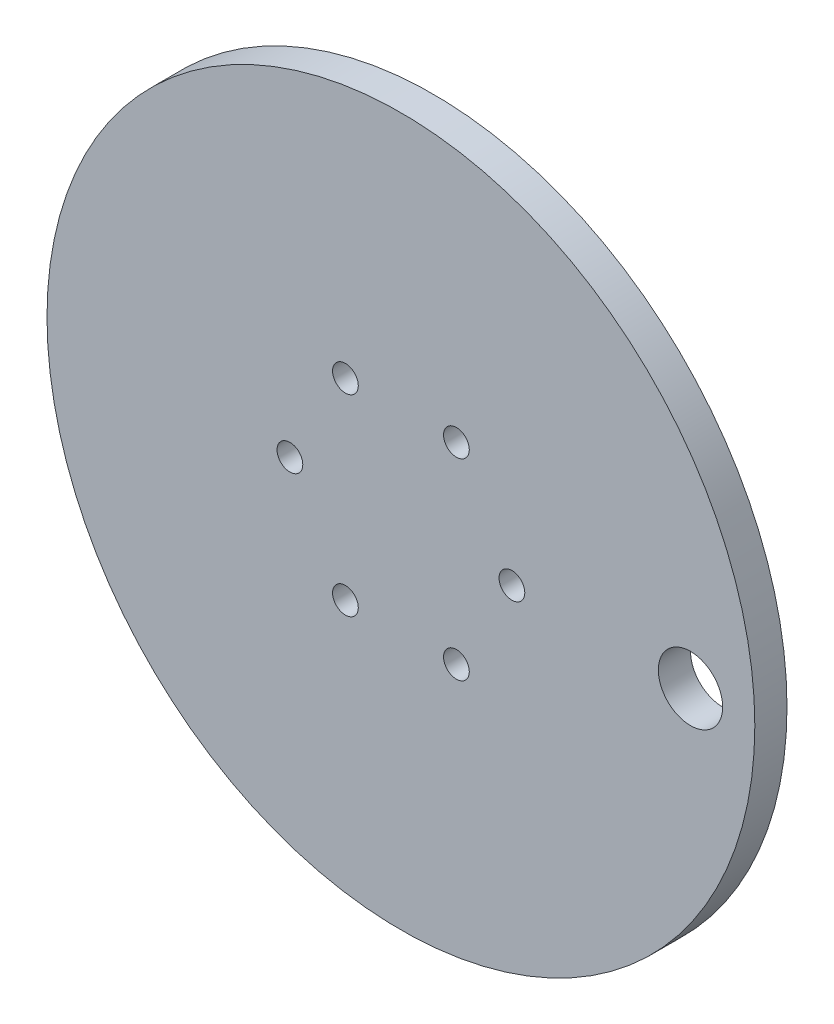
ISO-10303-21;
HEADER;
FILE_DESCRIPTION(('STEP AP214'),'2;1');
FILE_NAME('part.step','',(''),(''),'','','');
FILE_SCHEMA(('AUTOMOTIVE_DESIGN { 1 0 10303 214 1 1 1 1 }'));
ENDSEC;
DATA;
#1=APPLICATION_CONTEXT('core data for automotive mechanical design processes');
#2=APPLICATION_PROTOCOL_DEFINITION('international standard','automotive_design',2000,#1);
#3=PRODUCT_CONTEXT('',#1,'mechanical');
#4=PRODUCT('Part','Part','',(#3));
#5=PRODUCT_RELATED_PRODUCT_CATEGORY('part','',(#4));
#6=PRODUCT_DEFINITION_FORMATION('','',#4);
#7=PRODUCT_DEFINITION_CONTEXT('part definition',#1,'design');
#8=PRODUCT_DEFINITION('design','',#6,#7);
#9=PRODUCT_DEFINITION_SHAPE('','',#8);
#10=(LENGTH_UNIT() NAMED_UNIT(*) SI_UNIT(.MILLI.,.METRE.));
#11=(NAMED_UNIT(*) PLANE_ANGLE_UNIT() SI_UNIT($,.RADIAN.));
#12=(NAMED_UNIT(*) SI_UNIT($,.STERADIAN.) SOLID_ANGLE_UNIT());
#13=UNCERTAINTY_MEASURE_WITH_UNIT(LENGTH_MEASURE(1.E-05),#10,'distance_accuracy_value','');
#14=(GEOMETRIC_REPRESENTATION_CONTEXT(3) GLOBAL_UNCERTAINTY_ASSIGNED_CONTEXT((#13)) GLOBAL_UNIT_ASSIGNED_CONTEXT((#10,
#11,#12)) REPRESENTATION_CONTEXT('',''));
#15=CARTESIAN_POINT('',(0.,0.,0.));
#16=DIRECTION('',(0.,0.,1.));
#17=DIRECTION('',(1.,0.,0.));
#18=AXIS2_PLACEMENT_3D('',#15,#16,#17);
#19=CARTESIAN_POINT('',(0.,0.,5.));
#20=DIRECTION('',(0.,0.,-1.));
#21=DIRECTION('',(-1.,0.,0.));
#22=AXIS2_PLACEMENT_3D('',#19,#20,#21);
#23=CYLINDRICAL_SURFACE('',#22,22.5);
#24=CARTESIAN_POINT('',(0.,0.,5.));
#25=DIRECTION('',(0.,0.,1.));
#26=DIRECTION('',(1.,0.,0.));
#27=AXIS2_PLACEMENT_3D('',#24,#25,#26);
#28=CIRCLE('',#27,22.5);
#29=CARTESIAN_POINT('',(22.5,0.,5.));
#30=VERTEX_POINT('',#29);
#31=EDGE_CURVE('E11',#30,#30,#28,.T.);
#32=ORIENTED_EDGE('',*,*,#31,.F.);
#33=EDGE_LOOP('',(#32));
#34=FACE_BOUND('',#33,.T.);
#35=CARTESIAN_POINT('',(0.,0.,0.));
#36=DIRECTION('',(0.,0.,1.));
#37=DIRECTION('',(1.,0.,0.));
#38=AXIS2_PLACEMENT_3D('',#35,#36,#37);
#39=CIRCLE('',#38,22.5);
#40=CARTESIAN_POINT('',(22.5,0.,0.));
#41=VERTEX_POINT('',#40);
#42=EDGE_CURVE('E46',#41,#41,#39,.T.);
#43=ORIENTED_EDGE('',*,*,#42,.T.);
#44=EDGE_LOOP('',(#43));
#45=FACE_BOUND('',#44,.T.);
#46=ADVANCED_FACE('F43',(#34,#45),#23,.T.);
#47=CARTESIAN_POINT('',(0.,0.,0.));
#48=DIRECTION('',(0.,0.,1.));
#49=DIRECTION('',(1.,0.,0.));
#50=AXIS2_PLACEMENT_3D('',#47,#48,#49);
#51=PLANE('',#50);
#52=CARTESIAN_POINT('',(17.25,0.,0.));
#53=DIRECTION('',(0.,0.,1.));
#54=DIRECTION('',(1.,0.,0.));
#55=AXIS2_PLACEMENT_3D('',#52,#53,#54);
#56=CIRCLE('',#55,2.);
#57=CARTESIAN_POINT('',(19.25,0.,0.));
#58=VERTEX_POINT('',#57);
#59=EDGE_CURVE('E53',#58,#58,#56,.T.);
#60=ORIENTED_EDGE('',*,*,#59,.T.);
#61=EDGE_LOOP('',(#60));
#62=FACE_BOUND('',#61,.T.);
#63=CARTESIAN_POINT('',(8.62500000000018,14.9389382152815,0.));
#64=DIRECTION('',(0.,0.,1.));
#65=DIRECTION('',(1.,0.,0.));
#66=AXIS2_PLACEMENT_3D('',#63,#64,#65);
#67=CIRCLE('',#66,2.);
#68=CARTESIAN_POINT('',(10.6250000000002,14.9389382152815,0.));
#69=VERTEX_POINT('',#68);
#70=EDGE_CURVE('E59',#69,#69,#67,.T.);
#71=ORIENTED_EDGE('',*,*,#70,.T.);
#72=EDGE_LOOP('',(#71));
#73=FACE_BOUND('',#72,.T.);
#74=CARTESIAN_POINT('',(-8.62499999999986,14.9389382152816,0.));
#75=DIRECTION('',(0.,0.,1.));
#76=DIRECTION('',(1.,0.,0.));
#77=AXIS2_PLACEMENT_3D('',#74,#75,#76);
#78=CIRCLE('',#77,2.);
#79=CARTESIAN_POINT('',(-6.62499999999986,14.9389382152816,0.));
#80=VERTEX_POINT('',#79);
#81=EDGE_CURVE('E55',#80,#80,#78,.T.);
#82=ORIENTED_EDGE('',*,*,#81,.T.);
#83=EDGE_LOOP('',(#82));
#84=FACE_BOUND('',#83,.T.);
#85=CARTESIAN_POINT('',(-17.25,1.20456106190088E-13,0.));
#86=DIRECTION('',(0.,0.,1.));
#87=DIRECTION('',(1.,0.,0.));
#88=AXIS2_PLACEMENT_3D('',#85,#86,#87);
#89=CIRCLE('',#88,2.);
#90=CARTESIAN_POINT('',(-15.25,1.20456106190088E-13,0.));
#91=VERTEX_POINT('',#90);
#92=EDGE_CURVE('E58',#91,#91,#89,.T.);
#93=ORIENTED_EDGE('',*,*,#92,.T.);
#94=EDGE_LOOP('',(#93));
#95=FACE_BOUND('',#94,.T.);
#96=CARTESIAN_POINT('',(-8.62500000000007,-14.9389382152815,0.));
#97=DIRECTION('',(0.,0.,1.));
#98=DIRECTION('',(1.,0.,0.));
#99=AXIS2_PLACEMENT_3D('',#96,#97,#98);
#100=CIRCLE('',#99,2.);
#101=CARTESIAN_POINT('',(-6.62500000000007,-14.9389382152815,0.));
#102=VERTEX_POINT('',#101);
#103=EDGE_CURVE('E62',#102,#102,#100,.T.);
#104=ORIENTED_EDGE('',*,*,#103,.T.);
#105=EDGE_LOOP('',(#104));
#106=FACE_BOUND('',#105,.T.);
#107=CARTESIAN_POINT('',(8.62499999999997,-14.9389382152816,0.));
#108=DIRECTION('',(0.,0.,1.));
#109=DIRECTION('',(1.,0.,0.));
#110=AXIS2_PLACEMENT_3D('',#107,#108,#109);
#111=CIRCLE('',#110,2.);
#112=CARTESIAN_POINT('',(10.625,-14.9389382152816,0.));
#113=VERTEX_POINT('',#112);
#114=EDGE_CURVE('E65',#113,#113,#111,.T.);
#115=ORIENTED_EDGE('',*,*,#114,.T.);
#116=EDGE_LOOP('',(#115));
#117=FACE_BOUND('',#116,.T.);
#118=ORIENTED_EDGE('',*,*,#42,.F.);
#119=EDGE_LOOP('',(#118));
#120=FACE_BOUND('',#119,.T.);
#121=ADVANCED_FACE('F125',(#62,#73,#84,#95,#106,#117,#120),#51,.F.);
#122=CARTESIAN_POINT('',(8.62499999999997,-14.9389382152816,0.));
#123=DIRECTION('',(0.,0.,1.));
#124=DIRECTION('',(1.,0.,0.));
#125=AXIS2_PLACEMENT_3D('',#122,#123,#124);
#126=CYLINDRICAL_SURFACE('',#125,2.);
#127=ORIENTED_EDGE('',*,*,#114,.F.);
#128=EDGE_LOOP('',(#127));
#129=FACE_BOUND('',#128,.T.);
#130=CARTESIAN_POINT('',(8.62499999999997,-14.9389382152816,10.));
#131=DIRECTION('',(0.,0.,-1.));
#132=DIRECTION('',(-1.,0.,0.));
#133=AXIS2_PLACEMENT_3D('',#130,#131,#132);
#134=CIRCLE('',#133,2.);
#135=CARTESIAN_POINT('',(6.62499999999996,-14.9389382152816,10.));
#136=VERTEX_POINT('',#135);
#137=EDGE_CURVE('E88',#136,#136,#134,.T.);
#138=ORIENTED_EDGE('',*,*,#137,.F.);
#139=EDGE_LOOP('',(#138));
#140=FACE_BOUND('',#139,.T.);
#141=ADVANCED_FACE('F130',(#129,#140),#126,.F.);
#142=CARTESIAN_POINT('',(-8.62500000000007,-14.9389382152815,0.));
#143=DIRECTION('',(0.,0.,1.));
#144=DIRECTION('',(1.,0.,0.));
#145=AXIS2_PLACEMENT_3D('',#142,#143,#144);
#146=CYLINDRICAL_SURFACE('',#145,2.);
#147=ORIENTED_EDGE('',*,*,#103,.F.);
#148=EDGE_LOOP('',(#147));
#149=FACE_BOUND('',#148,.T.);
#150=CARTESIAN_POINT('',(-8.62500000000007,-14.9389382152815,10.));
#151=DIRECTION('',(0.,0.,-1.));
#152=DIRECTION('',(-1.,0.,0.));
#153=AXIS2_PLACEMENT_3D('',#150,#151,#152);
#154=CIRCLE('',#153,2.);
#155=CARTESIAN_POINT('',(-10.6250000000001,-14.9389382152815,10.));
#156=VERTEX_POINT('',#155);
#157=EDGE_CURVE('E91',#156,#156,#154,.T.);
#158=ORIENTED_EDGE('',*,*,#157,.F.);
#159=EDGE_LOOP('',(#158));
#160=FACE_BOUND('',#159,.T.);
#161=ADVANCED_FACE('F139',(#149,#160),#146,.F.);
#162=CARTESIAN_POINT('',(-17.25,1.20456106190088E-13,0.));
#163=DIRECTION('',(0.,0.,1.));
#164=DIRECTION('',(1.,0.,0.));
#165=AXIS2_PLACEMENT_3D('',#162,#163,#164);
#166=CYLINDRICAL_SURFACE('',#165,2.);
#167=ORIENTED_EDGE('',*,*,#92,.F.);
#168=EDGE_LOOP('',(#167));
#169=FACE_BOUND('',#168,.T.);
#170=CARTESIAN_POINT('',(-17.25,1.20456106190088E-13,10.));
#171=DIRECTION('',(0.,0.,-1.));
#172=DIRECTION('',(-1.,0.,0.));
#173=AXIS2_PLACEMENT_3D('',#170,#171,#172);
#174=CIRCLE('',#173,2.);
#175=CARTESIAN_POINT('',(-19.25,1.20456106190088E-13,10.));
#176=VERTEX_POINT('',#175);
#177=EDGE_CURVE('E85',#176,#176,#174,.T.);
#178=ORIENTED_EDGE('',*,*,#177,.F.);
#179=EDGE_LOOP('',(#178));
#180=FACE_BOUND('',#179,.T.);
#181=ADVANCED_FACE('F146',(#169,#180),#166,.F.);
#182=CARTESIAN_POINT('',(-8.62499999999986,14.9389382152816,0.));
#183=DIRECTION('',(0.,0.,1.));
#184=DIRECTION('',(1.,0.,0.));
#185=AXIS2_PLACEMENT_3D('',#182,#183,#184);
#186=CYLINDRICAL_SURFACE('',#185,2.);
#187=ORIENTED_EDGE('',*,*,#81,.F.);
#188=EDGE_LOOP('',(#187));
#189=FACE_BOUND('',#188,.T.);
#190=CARTESIAN_POINT('',(-8.62499999999986,14.9389382152816,10.));
#191=DIRECTION('',(0.,0.,-1.));
#192=DIRECTION('',(-1.,0.,0.));
#193=AXIS2_PLACEMENT_3D('',#190,#191,#192);
#194=CIRCLE('',#193,2.);
#195=CARTESIAN_POINT('',(-10.6249999999999,14.9389382152816,10.));
#196=VERTEX_POINT('',#195);
#197=EDGE_CURVE('E94',#196,#196,#194,.T.);
#198=ORIENTED_EDGE('',*,*,#197,.F.);
#199=EDGE_LOOP('',(#198));
#200=FACE_BOUND('',#199,.T.);
#201=ADVANCED_FACE('F119',(#189,#200),#186,.F.);
#202=CARTESIAN_POINT('',(8.62500000000018,14.9389382152815,0.));
#203=DIRECTION('',(0.,0.,1.));
#204=DIRECTION('',(1.,0.,0.));
#205=AXIS2_PLACEMENT_3D('',#202,#203,#204);
#206=CYLINDRICAL_SURFACE('',#205,2.);
#207=ORIENTED_EDGE('',*,*,#70,.F.);
#208=EDGE_LOOP('',(#207));
#209=FACE_BOUND('',#208,.T.);
#210=CARTESIAN_POINT('',(8.62500000000018,14.9389382152815,10.));
#211=DIRECTION('',(0.,0.,-1.));
#212=DIRECTION('',(-1.,0.,0.));
#213=AXIS2_PLACEMENT_3D('',#210,#211,#212);
#214=CIRCLE('',#213,2.);
#215=CARTESIAN_POINT('',(6.62500000000018,14.9389382152815,10.));
#216=VERTEX_POINT('',#215);
#217=EDGE_CURVE('E97',#216,#216,#214,.T.);
#218=ORIENTED_EDGE('',*,*,#217,.F.);
#219=EDGE_LOOP('',(#218));
#220=FACE_BOUND('',#219,.T.);
#221=ADVANCED_FACE('F109',(#209,#220),#206,.F.);
#222=CARTESIAN_POINT('',(17.25,0.,0.));
#223=DIRECTION('',(0.,0.,1.));
#224=DIRECTION('',(1.,0.,0.));
#225=AXIS2_PLACEMENT_3D('',#222,#223,#224);
#226=CYLINDRICAL_SURFACE('',#225,2.);
#227=ORIENTED_EDGE('',*,*,#59,.F.);
#228=EDGE_LOOP('',(#227));
#229=FACE_BOUND('',#228,.T.);
#230=CARTESIAN_POINT('',(17.25,0.,10.));
#231=DIRECTION('',(0.,0.,-1.));
#232=DIRECTION('',(-1.,0.,0.));
#233=AXIS2_PLACEMENT_3D('',#230,#231,#232);
#234=CIRCLE('',#233,2.);
#235=CARTESIAN_POINT('',(15.25,0.,10.));
#236=VERTEX_POINT('',#235);
#237=EDGE_CURVE('E84',#236,#236,#234,.T.);
#238=ORIENTED_EDGE('',*,*,#237,.F.);
#239=EDGE_LOOP('',(#238));
#240=FACE_BOUND('',#239,.T.);
#241=ADVANCED_FACE('F106',(#229,#240),#226,.F.);
#242=CARTESIAN_POINT('',(0.,0.,5.));
#243=DIRECTION('',(0.,0.,1.));
#244=DIRECTION('',(1.,0.,0.));
#245=AXIS2_PLACEMENT_3D('',#242,#243,#244);
#246=PLANE('',#245);
#247=CARTESIAN_POINT('',(45.,0.,5.));
#248=DIRECTION('',(0.,0.,1.));
#249=DIRECTION('',(1.,0.,0.));
#250=AXIS2_PLACEMENT_3D('',#247,#248,#249);
#251=CIRCLE('',#250,5.);
#252=CARTESIAN_POINT('',(50.,0.,5.));
#253=VERTEX_POINT('',#252);
#254=EDGE_CURVE('E76',#253,#253,#251,.T.);
#255=ORIENTED_EDGE('',*,*,#254,.T.);
#256=EDGE_LOOP('',(#255));
#257=FACE_BOUND('',#256,.T.);
#258=ORIENTED_EDGE('',*,*,#31,.T.);
#259=EDGE_LOOP('',(#258));
#260=FACE_BOUND('',#259,.T.);
#261=CARTESIAN_POINT('',(0.,0.,5.));
#262=DIRECTION('',(0.,0.,1.));
#263=DIRECTION('',(1.,0.,0.));
#264=AXIS2_PLACEMENT_3D('',#261,#262,#263);
#265=CIRCLE('',#264,55.);
#266=CARTESIAN_POINT('',(55.,0.,5.));
#267=VERTEX_POINT('',#266);
#268=EDGE_CURVE('E73',#267,#267,#265,.T.);
#269=ORIENTED_EDGE('',*,*,#268,.F.);
#270=EDGE_LOOP('',(#269));
#271=FACE_BOUND('',#270,.T.);
#272=ADVANCED_FACE('F108',(#257,#260,#271),#246,.F.);
#273=CARTESIAN_POINT('',(0.,0.,10.));
#274=DIRECTION('',(0.,0.,1.));
#275=DIRECTION('',(1.,0.,0.));
#276=AXIS2_PLACEMENT_3D('',#273,#274,#275);
#277=PLANE('',#276);
#278=ORIENTED_EDGE('',*,*,#237,.T.);
#279=EDGE_LOOP('',(#278));
#280=FACE_BOUND('',#279,.T.);
#281=ORIENTED_EDGE('',*,*,#217,.T.);
#282=EDGE_LOOP('',(#281));
#283=FACE_BOUND('',#282,.T.);
#284=ORIENTED_EDGE('',*,*,#197,.T.);
#285=EDGE_LOOP('',(#284));
#286=FACE_BOUND('',#285,.T.);
#287=ORIENTED_EDGE('',*,*,#157,.T.);
#288=EDGE_LOOP('',(#287));
#289=FACE_BOUND('',#288,.T.);
#290=ORIENTED_EDGE('',*,*,#137,.T.);
#291=EDGE_LOOP('',(#290));
#292=FACE_BOUND('',#291,.T.);
#293=ORIENTED_EDGE('',*,*,#177,.T.);
#294=EDGE_LOOP('',(#293));
#295=FACE_BOUND('',#294,.T.);
#296=CARTESIAN_POINT('',(45.,0.,10.));
#297=DIRECTION('',(0.,0.,1.));
#298=DIRECTION('',(1.,0.,0.));
#299=AXIS2_PLACEMENT_3D('',#296,#297,#298);
#300=CIRCLE('',#299,5.);
#301=CARTESIAN_POINT('',(50.,0.,10.));
#302=VERTEX_POINT('',#301);
#303=EDGE_CURVE('E81',#302,#302,#300,.T.);
#304=ORIENTED_EDGE('',*,*,#303,.F.);
#305=EDGE_LOOP('',(#304));
#306=FACE_BOUND('',#305,.T.);
#307=CARTESIAN_POINT('',(0.,0.,10.));
#308=DIRECTION('',(0.,0.,1.));
#309=DIRECTION('',(1.,0.,0.));
#310=AXIS2_PLACEMENT_3D('',#307,#308,#309);
#311=CIRCLE('',#310,55.);
#312=CARTESIAN_POINT('',(55.,0.,10.));
#313=VERTEX_POINT('',#312);
#314=EDGE_CURVE('E70',#313,#313,#311,.T.);
#315=ORIENTED_EDGE('',*,*,#314,.T.);
#316=EDGE_LOOP('',(#315));
#317=FACE_BOUND('',#316,.T.);
#318=ADVANCED_FACE('F103',(#280,#283,#286,#289,#292,#295,#306,#317),#277,.T.);
#319=CARTESIAN_POINT('',(0.,0.,10.));
#320=DIRECTION('',(0.,0.,-1.));
#321=DIRECTION('',(-1.,0.,0.));
#322=AXIS2_PLACEMENT_3D('',#319,#320,#321);
#323=CYLINDRICAL_SURFACE('',#322,55.);
#324=ORIENTED_EDGE('',*,*,#314,.F.);
#325=EDGE_LOOP('',(#324));
#326=FACE_BOUND('',#325,.T.);
#327=ORIENTED_EDGE('',*,*,#268,.T.);
#328=EDGE_LOOP('',(#327));
#329=FACE_BOUND('',#328,.T.);
#330=ADVANCED_FACE('F160',(#326,#329),#323,.T.);
#331=CARTESIAN_POINT('',(45.,0.,0.));
#332=DIRECTION('',(0.,0.,1.));
#333=DIRECTION('',(1.,0.,0.));
#334=AXIS2_PLACEMENT_3D('',#331,#332,#333);
#335=CYLINDRICAL_SURFACE('',#334,5.);
#336=ORIENTED_EDGE('',*,*,#303,.T.);
#337=EDGE_LOOP('',(#336));
#338=FACE_BOUND('',#337,.T.);
#339=ORIENTED_EDGE('',*,*,#254,.F.);
#340=EDGE_LOOP('',(#339));
#341=FACE_BOUND('',#340,.T.);
#342=ADVANCED_FACE('F171',(#338,#341),#335,.F.);
#343=CLOSED_SHELL('',(#46,#121,#141,#161,#181,#201,#221,#241,#272,#318,#330,#342));
#344=MANIFOLD_SOLID_BREP('B2',#343);
#345=ADVANCED_BREP_SHAPE_REPRESENTATION('',(#18,#344),#14);
#346=SHAPE_DEFINITION_REPRESENTATION(#9,#345);
ENDSEC;
END-ISO-10303-21;
